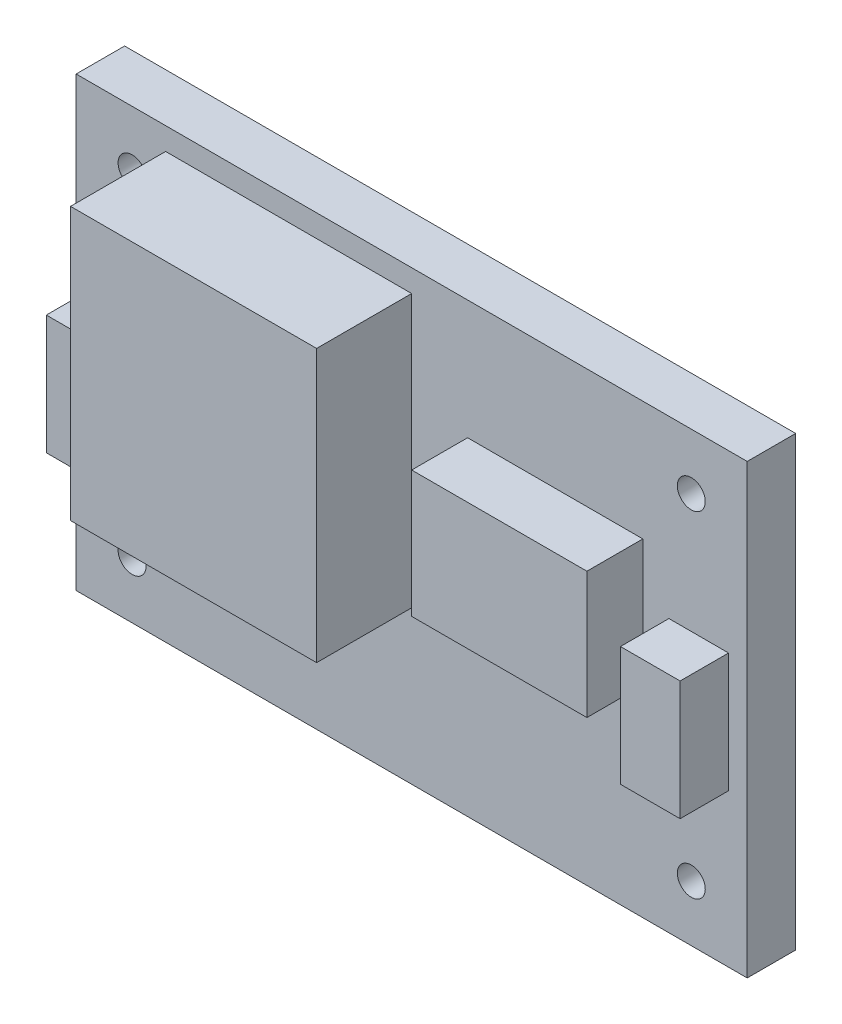
ISO-10303-21;
HEADER;
FILE_DESCRIPTION(('STEP AP214'),'2;1');
FILE_NAME('part.step','',(''),(''),'','','');
FILE_SCHEMA(('AUTOMOTIVE_DESIGN { 1 0 10303 214 1 1 1 1 }'));
ENDSEC;
DATA;
#1=APPLICATION_CONTEXT('core data for automotive mechanical design processes');
#2=APPLICATION_PROTOCOL_DEFINITION('international standard','automotive_design',2000,#1);
#3=PRODUCT_CONTEXT('',#1,'mechanical');
#4=PRODUCT('Part','Part','',(#3));
#5=PRODUCT_RELATED_PRODUCT_CATEGORY('part','',(#4));
#6=PRODUCT_DEFINITION_FORMATION('','',#4);
#7=PRODUCT_DEFINITION_CONTEXT('part definition',#1,'design');
#8=PRODUCT_DEFINITION('design','',#6,#7);
#9=PRODUCT_DEFINITION_SHAPE('','',#8);
#10=(LENGTH_UNIT() NAMED_UNIT(*) SI_UNIT(.MILLI.,.METRE.));
#11=(NAMED_UNIT(*) PLANE_ANGLE_UNIT() SI_UNIT($,.RADIAN.));
#12=(NAMED_UNIT(*) SI_UNIT($,.STERADIAN.) SOLID_ANGLE_UNIT());
#13=UNCERTAINTY_MEASURE_WITH_UNIT(LENGTH_MEASURE(1.E-05),#10,'distance_accuracy_value','');
#14=(GEOMETRIC_REPRESENTATION_CONTEXT(3) GLOBAL_UNCERTAINTY_ASSIGNED_CONTEXT((#13)) GLOBAL_UNIT_ASSIGNED_CONTEXT((#10,
#11,#12)) REPRESENTATION_CONTEXT('',''));
#15=CARTESIAN_POINT('',(0.,0.,0.));
#16=DIRECTION('',(0.,0.,1.));
#17=DIRECTION('',(1.,0.,0.));
#18=AXIS2_PLACEMENT_3D('',#15,#16,#17);
#19=CARTESIAN_POINT('',(0.,0.,1.3));
#20=DIRECTION('',(0.,0.,-1.));
#21=DIRECTION('',(-1.,0.,0.));
#22=AXIS2_PLACEMENT_3D('',#19,#20,#21);
#23=PLANE('',#22);
#24=DIRECTION('',(0.,-1.,0.));
#25=VECTOR('',#24,1.);
#26=CARTESIAN_POINT('',(0.5,7.3,1.3));
#27=LINE('',#26,#25);
#28=CARTESIAN_POINT('',(0.5,7.3,1.3));
#29=VERTEX_POINT('',#28);
#30=CARTESIAN_POINT('',(0.5,4.1,1.3));
#31=VERTEX_POINT('',#30);
#32=EDGE_CURVE('E191',#29,#31,#27,.T.);
#33=ORIENTED_EDGE('',*,*,#32,.F.);
#34=DIRECTION('',(-1.,0.,0.));
#35=VECTOR('',#34,1.);
#36=CARTESIAN_POINT('',(0.5,7.3,1.3));
#37=LINE('',#36,#35);
#38=CARTESIAN_POINT('',(2.1,7.3,1.3));
#39=VERTEX_POINT('',#38);
#40=EDGE_CURVE('E204',#39,#29,#37,.T.);
#41=ORIENTED_EDGE('',*,*,#40,.F.);
#42=DIRECTION('',(0.,1.,0.));
#43=VECTOR('',#42,1.);
#44=CARTESIAN_POINT('',(2.1,7.3,1.3));
#45=LINE('',#44,#43);
#46=CARTESIAN_POINT('',(2.1,4.1,1.3));
#47=VERTEX_POINT('',#46);
#48=EDGE_CURVE('E213',#47,#39,#45,.T.);
#49=ORIENTED_EDGE('',*,*,#48,.F.);
#50=DIRECTION('',(1.,0.,0.));
#51=VECTOR('',#50,1.);
#52=CARTESIAN_POINT('',(0.5,4.1,1.3));
#53=LINE('',#52,#51);
#54=EDGE_CURVE('E194',#31,#47,#53,.T.);
#55=ORIENTED_EDGE('',*,*,#54,.F.);
#56=EDGE_LOOP('',(#33,#41,#49,#55));
#57=FACE_BOUND('',#56,.T.);
#58=CARTESIAN_POINT('',(1.5,1.5,1.3));
#59=DIRECTION('',(0.,0.,1.));
#60=DIRECTION('',(-1.,0.,0.));
#61=AXIS2_PLACEMENT_3D('',#58,#59,#60);
#62=CIRCLE('',#61,0.375);
#63=CARTESIAN_POINT('',(1.125,1.5,1.3));
#64=VERTEX_POINT('',#63);
#65=EDGE_CURVE('E229',#64,#64,#62,.T.);
#66=ORIENTED_EDGE('',*,*,#65,.F.);
#67=EDGE_LOOP('',(#66));
#68=FACE_BOUND('',#67,.T.);
#69=CARTESIAN_POINT('',(16.5,1.5,1.3));
#70=DIRECTION('',(0.,0.,1.));
#71=DIRECTION('',(1.,0.,0.));
#72=AXIS2_PLACEMENT_3D('',#69,#70,#71);
#73=CIRCLE('',#72,0.374999999999996);
#74=CARTESIAN_POINT('',(16.875,1.5,1.3));
#75=VERTEX_POINT('',#74);
#76=EDGE_CURVE('E240',#75,#75,#73,.T.);
#77=ORIENTED_EDGE('',*,*,#76,.F.);
#78=EDGE_LOOP('',(#77));
#79=FACE_BOUND('',#78,.T.);
#80=CARTESIAN_POINT('',(16.5,10.5,1.3));
#81=DIRECTION('',(0.,0.,1.));
#82=DIRECTION('',(-1.,0.,0.));
#83=AXIS2_PLACEMENT_3D('',#80,#81,#82);
#84=CIRCLE('',#83,0.374999999999996);
#85=CARTESIAN_POINT('',(16.125,10.5,1.3));
#86=VERTEX_POINT('',#85);
#87=EDGE_CURVE('E234',#86,#86,#84,.T.);
#88=ORIENTED_EDGE('',*,*,#87,.F.);
#89=EDGE_LOOP('',(#88));
#90=FACE_BOUND('',#89,.T.);
#91=CARTESIAN_POINT('',(1.5,10.5,1.3));
#92=DIRECTION('',(0.,0.,1.));
#93=DIRECTION('',(1.,0.,0.));
#94=AXIS2_PLACEMENT_3D('',#91,#92,#93);
#95=CIRCLE('',#94,0.375);
#96=CARTESIAN_POINT('',(1.875,10.5,1.3));
#97=VERTEX_POINT('',#96);
#98=EDGE_CURVE('E233',#97,#97,#95,.T.);
#99=ORIENTED_EDGE('',*,*,#98,.F.);
#100=EDGE_LOOP('',(#99));
#101=FACE_BOUND('',#100,.T.);
#102=DIRECTION('',(0.,-1.,0.));
#103=VECTOR('',#102,1.);
#104=CARTESIAN_POINT('',(2.4,11.4,1.3));
#105=LINE('',#104,#103);
#106=CARTESIAN_POINT('',(2.4,11.4,1.3));
#107=VERTEX_POINT('',#106);
#108=CARTESIAN_POINT('',(2.4,4.1,1.3));
#109=VERTEX_POINT('',#108);
#110=EDGE_CURVE('E286',#107,#109,#105,.T.);
#111=ORIENTED_EDGE('',*,*,#110,.F.);
#112=DIRECTION('',(-1.,0.,0.));
#113=VECTOR('',#112,1.);
#114=CARTESIAN_POINT('',(2.4,11.4,1.3));
#115=LINE('',#114,#113);
#116=CARTESIAN_POINT('',(9.,11.4,1.3));
#117=VERTEX_POINT('',#116);
#118=EDGE_CURVE('E291',#117,#107,#115,.T.);
#119=ORIENTED_EDGE('',*,*,#118,.F.);
#120=DIRECTION('',(0.,1.,0.));
#121=VECTOR('',#120,1.);
#122=CARTESIAN_POINT('',(9.,11.4,1.3));
#123=LINE('',#122,#121);
#124=CARTESIAN_POINT('',(9.,4.1,1.3));
#125=VERTEX_POINT('',#124);
#126=EDGE_CURVE('E303',#125,#117,#123,.T.);
#127=ORIENTED_EDGE('',*,*,#126,.F.);
#128=DIRECTION('',(1.,0.,0.));
#129=VECTOR('',#128,1.);
#130=CARTESIAN_POINT('',(2.4,4.1,1.3));
#131=LINE('',#130,#129);
#132=EDGE_CURVE('E300',#109,#125,#131,.T.);
#133=ORIENTED_EDGE('',*,*,#132,.F.);
#134=EDGE_LOOP('',(#111,#119,#127,#133));
#135=FACE_BOUND('',#134,.T.);
#136=DIRECTION('',(0.,-1.,0.));
#137=VECTOR('',#136,1.);
#138=CARTESIAN_POINT('',(0.,0.,1.3));
#139=LINE('',#138,#137);
#140=CARTESIAN_POINT('',(0.,12.,1.3));
#141=VERTEX_POINT('',#140);
#142=CARTESIAN_POINT('',(0.,0.,1.3));
#143=VERTEX_POINT('',#142);
#144=EDGE_CURVE('E320',#141,#143,#139,.T.);
#145=ORIENTED_EDGE('',*,*,#144,.T.);
#146=DIRECTION('',(1.,0.,0.));
#147=VECTOR('',#146,1.);
#148=CARTESIAN_POINT('',(0.,0.,1.3));
#149=LINE('',#148,#147);
#150=CARTESIAN_POINT('',(18.,0.,1.3));
#151=VERTEX_POINT('',#150);
#152=EDGE_CURVE('E323',#143,#151,#149,.T.);
#153=ORIENTED_EDGE('',*,*,#152,.T.);
#154=DIRECTION('',(0.,1.,0.));
#155=VECTOR('',#154,1.);
#156=CARTESIAN_POINT('',(18.,0.,1.3));
#157=LINE('',#156,#155);
#158=CARTESIAN_POINT('',(18.,12.,1.3));
#159=VERTEX_POINT('',#158);
#160=EDGE_CURVE('E326',#151,#159,#157,.T.);
#161=ORIENTED_EDGE('',*,*,#160,.T.);
#162=DIRECTION('',(-1.,0.,0.));
#163=VECTOR('',#162,1.);
#164=CARTESIAN_POINT('',(0.,12.,1.3));
#165=LINE('',#164,#163);
#166=EDGE_CURVE('E328',#159,#141,#165,.T.);
#167=ORIENTED_EDGE('',*,*,#166,.T.);
#168=EDGE_LOOP('',(#145,#153,#161,#167));
#169=FACE_BOUND('',#168,.T.);
#170=DIRECTION('',(0.,-1.,0.));
#171=VECTOR('',#170,1.);
#172=CARTESIAN_POINT('',(10.5,8.8,1.3));
#173=LINE('',#172,#171);
#174=CARTESIAN_POINT('',(10.5,8.8,1.3));
#175=VERTEX_POINT('',#174);
#176=CARTESIAN_POINT('',(10.5,5.4,1.3));
#177=VERTEX_POINT('',#176);
#178=EDGE_CURVE('E251',#175,#177,#173,.T.);
#179=ORIENTED_EDGE('',*,*,#178,.F.);
#180=DIRECTION('',(-1.,0.,0.));
#181=VECTOR('',#180,1.);
#182=CARTESIAN_POINT('',(10.5,8.8,1.3));
#183=LINE('',#182,#181);
#184=CARTESIAN_POINT('',(15.2,8.8,1.3));
#185=VERTEX_POINT('',#184);
#186=EDGE_CURVE('E258',#185,#175,#183,.T.);
#187=ORIENTED_EDGE('',*,*,#186,.F.);
#188=DIRECTION('',(0.,1.,0.));
#189=VECTOR('',#188,1.);
#190=CARTESIAN_POINT('',(15.2,8.8,1.3));
#191=LINE('',#190,#189);
#192=CARTESIAN_POINT('',(15.2,5.4,1.3));
#193=VERTEX_POINT('',#192);
#194=EDGE_CURVE('E270',#193,#185,#191,.T.);
#195=ORIENTED_EDGE('',*,*,#194,.F.);
#196=DIRECTION('',(1.,0.,0.));
#197=VECTOR('',#196,1.);
#198=CARTESIAN_POINT('',(10.5,5.4,1.3));
#199=LINE('',#198,#197);
#200=EDGE_CURVE('E267',#177,#193,#199,.T.);
#201=ORIENTED_EDGE('',*,*,#200,.F.);
#202=EDGE_LOOP('',(#179,#187,#195,#201));
#203=FACE_BOUND('',#202,.T.);
#204=DIRECTION('',(0.,-1.,0.));
#205=VECTOR('',#204,1.);
#206=CARTESIAN_POINT('',(15.9,7.3,1.3));
#207=LINE('',#206,#205);
#208=CARTESIAN_POINT('',(15.9,7.3,1.3));
#209=VERTEX_POINT('',#208);
#210=CARTESIAN_POINT('',(15.9,4.1,1.3));
#211=VERTEX_POINT('',#210);
#212=EDGE_CURVE('E190',#209,#211,#207,.T.);
#213=ORIENTED_EDGE('',*,*,#212,.F.);
#214=DIRECTION('',(-1.,0.,0.));
#215=VECTOR('',#214,1.);
#216=CARTESIAN_POINT('',(15.9,7.3,1.3));
#217=LINE('',#216,#215);
#218=CARTESIAN_POINT('',(17.5,7.3,1.3));
#219=VERTEX_POINT('',#218);
#220=EDGE_CURVE('E187',#219,#209,#217,.T.);
#221=ORIENTED_EDGE('',*,*,#220,.F.);
#222=DIRECTION('',(0.,1.,0.));
#223=VECTOR('',#222,1.);
#224=CARTESIAN_POINT('',(17.5,7.3,1.3));
#225=LINE('',#224,#223);
#226=CARTESIAN_POINT('',(17.5,4.1,1.3));
#227=VERTEX_POINT('',#226);
#228=EDGE_CURVE('E53',#227,#219,#225,.T.);
#229=ORIENTED_EDGE('',*,*,#228,.F.);
#230=DIRECTION('',(1.,0.,0.));
#231=VECTOR('',#230,1.);
#232=CARTESIAN_POINT('',(15.9,4.1,1.3));
#233=LINE('',#232,#231);
#234=EDGE_CURVE('E48',#211,#227,#233,.T.);
#235=ORIENTED_EDGE('',*,*,#234,.F.);
#236=EDGE_LOOP('',(#213,#221,#229,#235));
#237=FACE_BOUND('',#236,.T.);
#238=ADVANCED_FACE('F33',(#57,#68,#79,#90,#101,#135,#169,#203,#237),#23,.F.);
#239=CARTESIAN_POINT('',(0.,0.,1.3));
#240=DIRECTION('',(1.,0.,0.));
#241=DIRECTION('',(0.,0.,-1.));
#242=AXIS2_PLACEMENT_3D('',#239,#240,#241);
#243=PLANE('',#242);
#244=DIRECTION('',(0.,-1.,0.));
#245=VECTOR('',#244,1.);
#246=CARTESIAN_POINT('',(0.,0.,0.));
#247=LINE('',#246,#245);
#248=CARTESIAN_POINT('',(0.,12.,0.));
#249=VERTEX_POINT('',#248);
#250=CARTESIAN_POINT('',(0.,0.,0.));
#251=VERTEX_POINT('',#250);
#252=EDGE_CURVE('E319',#249,#251,#247,.T.);
#253=ORIENTED_EDGE('',*,*,#252,.T.);
#254=DIRECTION('',(0.,0.,-1.));
#255=VECTOR('',#254,1.);
#256=CARTESIAN_POINT('',(0.,0.,1.3));
#257=LINE('',#256,#255);
#258=EDGE_CURVE('E11',#143,#251,#257,.T.);
#259=ORIENTED_EDGE('',*,*,#258,.F.);
#260=ORIENTED_EDGE('',*,*,#144,.F.);
#261=DIRECTION('',(0.,0.,-1.));
#262=VECTOR('',#261,1.);
#263=CARTESIAN_POINT('',(0.,12.,1.3));
#264=LINE('',#263,#262);
#265=EDGE_CURVE('E330',#141,#249,#264,.T.);
#266=ORIENTED_EDGE('',*,*,#265,.T.);
#267=EDGE_LOOP('',(#253,#259,#260,#266));
#268=FACE_BOUND('',#267,.T.);
#269=ADVANCED_FACE('F35',(#268),#243,.F.);
#270=CARTESIAN_POINT('',(0.,0.,1.3));
#271=DIRECTION('',(0.,1.,0.));
#272=DIRECTION('',(0.,0.,1.));
#273=AXIS2_PLACEMENT_3D('',#270,#271,#272);
#274=PLANE('',#273);
#275=DIRECTION('',(1.,0.,0.));
#276=VECTOR('',#275,1.);
#277=CARTESIAN_POINT('',(0.,0.,0.));
#278=LINE('',#277,#276);
#279=CARTESIAN_POINT('',(18.,0.,0.));
#280=VERTEX_POINT('',#279);
#281=EDGE_CURVE('E333',#251,#280,#278,.T.);
#282=ORIENTED_EDGE('',*,*,#281,.T.);
#283=DIRECTION('',(0.,0.,-1.));
#284=VECTOR('',#283,1.);
#285=CARTESIAN_POINT('',(18.,0.,1.3));
#286=LINE('',#285,#284);
#287=EDGE_CURVE('E41',#151,#280,#286,.T.);
#288=ORIENTED_EDGE('',*,*,#287,.F.);
#289=ORIENTED_EDGE('',*,*,#152,.F.);
#290=ORIENTED_EDGE('',*,*,#258,.T.);
#291=EDGE_LOOP('',(#282,#288,#289,#290));
#292=FACE_BOUND('',#291,.T.);
#293=ADVANCED_FACE('F363',(#292),#274,.F.);
#294=CARTESIAN_POINT('',(18.,0.,1.3));
#295=DIRECTION('',(-1.,0.,0.));
#296=DIRECTION('',(0.,0.,1.));
#297=AXIS2_PLACEMENT_3D('',#294,#295,#296);
#298=PLANE('',#297);
#299=DIRECTION('',(0.,1.,0.));
#300=VECTOR('',#299,1.);
#301=CARTESIAN_POINT('',(18.,0.,0.));
#302=LINE('',#301,#300);
#303=CARTESIAN_POINT('',(18.,12.,0.));
#304=VERTEX_POINT('',#303);
#305=EDGE_CURVE('E335',#280,#304,#302,.T.);
#306=ORIENTED_EDGE('',*,*,#305,.T.);
#307=DIRECTION('',(0.,0.,-1.));
#308=VECTOR('',#307,1.);
#309=CARTESIAN_POINT('',(18.,12.,1.3));
#310=LINE('',#309,#308);
#311=EDGE_CURVE('E340',#159,#304,#310,.T.);
#312=ORIENTED_EDGE('',*,*,#311,.F.);
#313=ORIENTED_EDGE('',*,*,#160,.F.);
#314=ORIENTED_EDGE('',*,*,#287,.T.);
#315=EDGE_LOOP('',(#306,#312,#313,#314));
#316=FACE_BOUND('',#315,.T.);
#317=ADVANCED_FACE('F347',(#316),#298,.F.);
#318=CARTESIAN_POINT('',(0.,12.,1.3));
#319=DIRECTION('',(0.,-1.,0.));
#320=DIRECTION('',(0.,0.,-1.));
#321=AXIS2_PLACEMENT_3D('',#318,#319,#320);
#322=PLANE('',#321);
#323=DIRECTION('',(-1.,0.,0.));
#324=VECTOR('',#323,1.);
#325=CARTESIAN_POINT('',(0.,12.,0.));
#326=LINE('',#325,#324);
#327=EDGE_CURVE('E324',#304,#249,#326,.T.);
#328=ORIENTED_EDGE('',*,*,#327,.T.);
#329=ORIENTED_EDGE('',*,*,#265,.F.);
#330=ORIENTED_EDGE('',*,*,#166,.F.);
#331=ORIENTED_EDGE('',*,*,#311,.T.);
#332=EDGE_LOOP('',(#328,#329,#330,#331));
#333=FACE_BOUND('',#332,.T.);
#334=ADVANCED_FACE('F356',(#333),#322,.F.);
#335=CARTESIAN_POINT('',(0.,0.,0.));
#336=DIRECTION('',(0.,0.,-1.));
#337=DIRECTION('',(-1.,0.,0.));
#338=AXIS2_PLACEMENT_3D('',#335,#336,#337);
#339=PLANE('',#338);
#340=CARTESIAN_POINT('',(1.5,1.5,0.));
#341=DIRECTION('',(0.,0.,1.));
#342=DIRECTION('',(-1.,0.,0.));
#343=AXIS2_PLACEMENT_3D('',#340,#341,#342);
#344=CIRCLE('',#343,0.375);
#345=CARTESIAN_POINT('',(1.125,1.5,0.));
#346=VERTEX_POINT('',#345);
#347=EDGE_CURVE('E243',#346,#346,#344,.T.);
#348=ORIENTED_EDGE('',*,*,#347,.T.);
#349=EDGE_LOOP('',(#348));
#350=FACE_BOUND('',#349,.T.);
#351=CARTESIAN_POINT('',(16.5,1.5,0.));
#352=DIRECTION('',(0.,0.,1.));
#353=DIRECTION('',(1.,0.,0.));
#354=AXIS2_PLACEMENT_3D('',#351,#352,#353);
#355=CIRCLE('',#354,0.374999999999996);
#356=CARTESIAN_POINT('',(16.875,1.5,0.));
#357=VERTEX_POINT('',#356);
#358=EDGE_CURVE('E237',#357,#357,#355,.T.);
#359=ORIENTED_EDGE('',*,*,#358,.T.);
#360=EDGE_LOOP('',(#359));
#361=FACE_BOUND('',#360,.T.);
#362=CARTESIAN_POINT('',(16.5,10.5,0.));
#363=DIRECTION('',(0.,0.,1.));
#364=DIRECTION('',(-1.,0.,0.));
#365=AXIS2_PLACEMENT_3D('',#362,#363,#364);
#366=CIRCLE('',#365,0.374999999999996);
#367=CARTESIAN_POINT('',(16.125,10.5,0.));
#368=VERTEX_POINT('',#367);
#369=EDGE_CURVE('E230',#368,#368,#366,.T.);
#370=ORIENTED_EDGE('',*,*,#369,.T.);
#371=EDGE_LOOP('',(#370));
#372=FACE_BOUND('',#371,.T.);
#373=CARTESIAN_POINT('',(1.5,10.5,0.));
#374=DIRECTION('',(0.,0.,1.));
#375=DIRECTION('',(1.,0.,0.));
#376=AXIS2_PLACEMENT_3D('',#373,#374,#375);
#377=CIRCLE('',#376,0.375);
#378=CARTESIAN_POINT('',(1.875,10.5,0.));
#379=VERTEX_POINT('',#378);
#380=EDGE_CURVE('E248',#379,#379,#377,.T.);
#381=ORIENTED_EDGE('',*,*,#380,.T.);
#382=EDGE_LOOP('',(#381));
#383=FACE_BOUND('',#382,.T.);
#384=ORIENTED_EDGE('',*,*,#252,.F.);
#385=ORIENTED_EDGE('',*,*,#327,.F.);
#386=ORIENTED_EDGE('',*,*,#305,.F.);
#387=ORIENTED_EDGE('',*,*,#281,.F.);
#388=EDGE_LOOP('',(#384,#385,#386,#387));
#389=FACE_BOUND('',#388,.T.);
#390=ADVANCED_FACE('F353',(#350,#361,#372,#383,#389),#339,.T.);
#391=CARTESIAN_POINT('',(2.4,11.4,3.85));
#392=DIRECTION('',(1.,0.,0.));
#393=DIRECTION('',(0.,1.,0.));
#394=AXIS2_PLACEMENT_3D('',#391,#392,#393);
#395=PLANE('',#394);
#396=ORIENTED_EDGE('',*,*,#110,.T.);
#397=DIRECTION('',(0.,0.,-1.));
#398=VECTOR('',#397,1.);
#399=CARTESIAN_POINT('',(2.4,4.1,3.85));
#400=LINE('',#399,#398);
#401=CARTESIAN_POINT('',(2.4,4.1,3.85));
#402=VERTEX_POINT('',#401);
#403=EDGE_CURVE('E316',#402,#109,#400,.T.);
#404=ORIENTED_EDGE('',*,*,#403,.F.);
#405=DIRECTION('',(0.,-1.,0.));
#406=VECTOR('',#405,1.);
#407=CARTESIAN_POINT('',(2.4,11.4,3.85));
#408=LINE('',#407,#406);
#409=CARTESIAN_POINT('',(2.4,11.4,3.85));
#410=VERTEX_POINT('',#409);
#411=EDGE_CURVE('E287',#410,#402,#408,.T.);
#412=ORIENTED_EDGE('',*,*,#411,.F.);
#413=DIRECTION('',(0.,0.,-1.));
#414=VECTOR('',#413,1.);
#415=CARTESIAN_POINT('',(2.4,11.4,3.85));
#416=LINE('',#415,#414);
#417=EDGE_CURVE('E297',#410,#107,#416,.T.);
#418=ORIENTED_EDGE('',*,*,#417,.T.);
#419=EDGE_LOOP('',(#396,#404,#412,#418));
#420=FACE_BOUND('',#419,.T.);
#421=ADVANCED_FACE('F378',(#420),#395,.F.);
#422=CARTESIAN_POINT('',(2.4,4.1,3.85));
#423=DIRECTION('',(0.,1.,0.));
#424=DIRECTION('',(0.,0.,1.));
#425=AXIS2_PLACEMENT_3D('',#422,#423,#424);
#426=PLANE('',#425);
#427=ORIENTED_EDGE('',*,*,#132,.T.);
#428=DIRECTION('',(0.,0.,-1.));
#429=VECTOR('',#428,1.);
#430=CARTESIAN_POINT('',(9.,4.1,3.85));
#431=LINE('',#430,#429);
#432=CARTESIAN_POINT('',(9.,4.1,3.85));
#433=VERTEX_POINT('',#432);
#434=EDGE_CURVE('E313',#433,#125,#431,.T.);
#435=ORIENTED_EDGE('',*,*,#434,.F.);
#436=DIRECTION('',(1.,0.,0.));
#437=VECTOR('',#436,1.);
#438=CARTESIAN_POINT('',(2.4,4.1,3.85));
#439=LINE('',#438,#437);
#440=EDGE_CURVE('E290',#402,#433,#439,.T.);
#441=ORIENTED_EDGE('',*,*,#440,.F.);
#442=ORIENTED_EDGE('',*,*,#403,.T.);
#443=EDGE_LOOP('',(#427,#435,#441,#442));
#444=FACE_BOUND('',#443,.T.);
#445=ADVANCED_FACE('F400',(#444),#426,.F.);
#446=CARTESIAN_POINT('',(9.,11.4,3.85));
#447=DIRECTION('',(-1.,0.,0.));
#448=DIRECTION('',(0.,-1.,0.));
#449=AXIS2_PLACEMENT_3D('',#446,#447,#448);
#450=PLANE('',#449);
#451=ORIENTED_EDGE('',*,*,#126,.T.);
#452=DIRECTION('',(0.,0.,-1.));
#453=VECTOR('',#452,1.);
#454=CARTESIAN_POINT('',(9.,11.4,3.85));
#455=LINE('',#454,#453);
#456=CARTESIAN_POINT('',(9.,11.4,3.85));
#457=VERTEX_POINT('',#456);
#458=EDGE_CURVE('E310',#457,#117,#455,.T.);
#459=ORIENTED_EDGE('',*,*,#458,.F.);
#460=DIRECTION('',(0.,1.,0.));
#461=VECTOR('',#460,1.);
#462=CARTESIAN_POINT('',(9.,11.4,3.85));
#463=LINE('',#462,#461);
#464=EDGE_CURVE('E293',#433,#457,#463,.T.);
#465=ORIENTED_EDGE('',*,*,#464,.F.);
#466=ORIENTED_EDGE('',*,*,#434,.T.);
#467=EDGE_LOOP('',(#451,#459,#465,#466));
#468=FACE_BOUND('',#467,.T.);
#469=ADVANCED_FACE('F407',(#468),#450,.F.);
#470=CARTESIAN_POINT('',(2.4,11.4,3.85));
#471=DIRECTION('',(0.,-1.,0.));
#472=DIRECTION('',(1.,0.,0.));
#473=AXIS2_PLACEMENT_3D('',#470,#471,#472);
#474=PLANE('',#473);
#475=ORIENTED_EDGE('',*,*,#118,.T.);
#476=ORIENTED_EDGE('',*,*,#417,.F.);
#477=DIRECTION('',(-1.,0.,0.));
#478=VECTOR('',#477,1.);
#479=CARTESIAN_POINT('',(2.4,11.4,3.85));
#480=LINE('',#479,#478);
#481=EDGE_CURVE('E295',#457,#410,#480,.T.);
#482=ORIENTED_EDGE('',*,*,#481,.F.);
#483=ORIENTED_EDGE('',*,*,#458,.T.);
#484=EDGE_LOOP('',(#475,#476,#482,#483));
#485=FACE_BOUND('',#484,.T.);
#486=ADVANCED_FACE('F414',(#485),#474,.F.);
#487=CARTESIAN_POINT('',(0.,0.,3.85));
#488=DIRECTION('',(0.,0.,1.));
#489=DIRECTION('',(1.,0.,0.));
#490=AXIS2_PLACEMENT_3D('',#487,#488,#489);
#491=PLANE('',#490);
#492=ORIENTED_EDGE('',*,*,#411,.T.);
#493=ORIENTED_EDGE('',*,*,#440,.T.);
#494=ORIENTED_EDGE('',*,*,#464,.T.);
#495=ORIENTED_EDGE('',*,*,#481,.T.);
#496=EDGE_LOOP('',(#492,#493,#494,#495));
#497=FACE_BOUND('',#496,.T.);
#498=ADVANCED_FACE('F422',(#497),#491,.T.);
#499=CARTESIAN_POINT('',(10.5,8.8,2.8));
#500=DIRECTION('',(1.,0.,0.));
#501=DIRECTION('',(0.,0.,-1.));
#502=AXIS2_PLACEMENT_3D('',#499,#500,#501);
#503=PLANE('',#502);
#504=ORIENTED_EDGE('',*,*,#178,.T.);
#505=DIRECTION('',(0.,0.,-1.));
#506=VECTOR('',#505,1.);
#507=CARTESIAN_POINT('',(10.5,5.4,2.8));
#508=LINE('',#507,#506);
#509=CARTESIAN_POINT('',(10.5,5.4,2.8));
#510=VERTEX_POINT('',#509);
#511=EDGE_CURVE('E283',#510,#177,#508,.T.);
#512=ORIENTED_EDGE('',*,*,#511,.F.);
#513=DIRECTION('',(0.,-1.,0.));
#514=VECTOR('',#513,1.);
#515=CARTESIAN_POINT('',(10.5,8.8,2.8));
#516=LINE('',#515,#514);
#517=CARTESIAN_POINT('',(10.5,8.8,2.8));
#518=VERTEX_POINT('',#517);
#519=EDGE_CURVE('E254',#518,#510,#516,.T.);
#520=ORIENTED_EDGE('',*,*,#519,.F.);
#521=DIRECTION('',(0.,0.,-1.));
#522=VECTOR('',#521,1.);
#523=CARTESIAN_POINT('',(10.5,8.8,2.8));
#524=LINE('',#523,#522);
#525=EDGE_CURVE('E264',#518,#175,#524,.T.);
#526=ORIENTED_EDGE('',*,*,#525,.T.);
#527=EDGE_LOOP('',(#504,#512,#520,#526));
#528=FACE_BOUND('',#527,.T.);
#529=ADVANCED_FACE('F430',(#528),#503,.F.);
#530=CARTESIAN_POINT('',(10.5,5.4,2.8));
#531=DIRECTION('',(0.,1.,0.));
#532=DIRECTION('',(0.,0.,1.));
#533=AXIS2_PLACEMENT_3D('',#530,#531,#532);
#534=PLANE('',#533);
#535=ORIENTED_EDGE('',*,*,#200,.T.);
#536=DIRECTION('',(0.,0.,-1.));
#537=VECTOR('',#536,1.);
#538=CARTESIAN_POINT('',(15.2,5.4,2.8));
#539=LINE('',#538,#537);
#540=CARTESIAN_POINT('',(15.2,5.4,2.8));
#541=VERTEX_POINT('',#540);
#542=EDGE_CURVE('E280',#541,#193,#539,.T.);
#543=ORIENTED_EDGE('',*,*,#542,.F.);
#544=DIRECTION('',(1.,0.,0.));
#545=VECTOR('',#544,1.);
#546=CARTESIAN_POINT('',(10.5,5.4,2.8));
#547=LINE('',#546,#545);
#548=EDGE_CURVE('E257',#510,#541,#547,.T.);
#549=ORIENTED_EDGE('',*,*,#548,.F.);
#550=ORIENTED_EDGE('',*,*,#511,.T.);
#551=EDGE_LOOP('',(#535,#543,#549,#550));
#552=FACE_BOUND('',#551,.T.);
#553=ADVANCED_FACE('F438',(#552),#534,.F.);
#554=CARTESIAN_POINT('',(15.2,8.8,2.8));
#555=DIRECTION('',(-1.,0.,0.));
#556=DIRECTION('',(0.,0.,1.));
#557=AXIS2_PLACEMENT_3D('',#554,#555,#556);
#558=PLANE('',#557);
#559=ORIENTED_EDGE('',*,*,#194,.T.);
#560=DIRECTION('',(0.,0.,-1.));
#561=VECTOR('',#560,1.);
#562=CARTESIAN_POINT('',(15.2,8.8,2.8));
#563=LINE('',#562,#561);
#564=CARTESIAN_POINT('',(15.2,8.8,2.8));
#565=VERTEX_POINT('',#564);
#566=EDGE_CURVE('E277',#565,#185,#563,.T.);
#567=ORIENTED_EDGE('',*,*,#566,.F.);
#568=DIRECTION('',(0.,1.,0.));
#569=VECTOR('',#568,1.);
#570=CARTESIAN_POINT('',(15.2,8.8,2.8));
#571=LINE('',#570,#569);
#572=EDGE_CURVE('E260',#541,#565,#571,.T.);
#573=ORIENTED_EDGE('',*,*,#572,.F.);
#574=ORIENTED_EDGE('',*,*,#542,.T.);
#575=EDGE_LOOP('',(#559,#567,#573,#574));
#576=FACE_BOUND('',#575,.T.);
#577=ADVANCED_FACE('F446',(#576),#558,.F.);
#578=CARTESIAN_POINT('',(10.5,8.8,2.8));
#579=DIRECTION('',(0.,-1.,0.));
#580=DIRECTION('',(0.,0.,-1.));
#581=AXIS2_PLACEMENT_3D('',#578,#579,#580);
#582=PLANE('',#581);
#583=ORIENTED_EDGE('',*,*,#186,.T.);
#584=ORIENTED_EDGE('',*,*,#525,.F.);
#585=DIRECTION('',(-1.,0.,0.));
#586=VECTOR('',#585,1.);
#587=CARTESIAN_POINT('',(10.5,8.8,2.8));
#588=LINE('',#587,#586);
#589=EDGE_CURVE('E262',#565,#518,#588,.T.);
#590=ORIENTED_EDGE('',*,*,#589,.F.);
#591=ORIENTED_EDGE('',*,*,#566,.T.);
#592=EDGE_LOOP('',(#583,#584,#590,#591));
#593=FACE_BOUND('',#592,.T.);
#594=ADVANCED_FACE('F454',(#593),#582,.F.);
#595=CARTESIAN_POINT('',(0.,0.,2.8));
#596=DIRECTION('',(0.,0.,1.));
#597=DIRECTION('',(1.,0.,0.));
#598=AXIS2_PLACEMENT_3D('',#595,#596,#597);
#599=PLANE('',#598);
#600=ORIENTED_EDGE('',*,*,#519,.T.);
#601=ORIENTED_EDGE('',*,*,#548,.T.);
#602=ORIENTED_EDGE('',*,*,#572,.T.);
#603=ORIENTED_EDGE('',*,*,#589,.T.);
#604=EDGE_LOOP('',(#600,#601,#602,#603));
#605=FACE_BOUND('',#604,.T.);
#606=ADVANCED_FACE('F462',(#605),#599,.T.);
#607=CARTESIAN_POINT('',(1.5,10.5,0.));
#608=DIRECTION('',(0.,0.,1.));
#609=DIRECTION('',(1.,0.,0.));
#610=AXIS2_PLACEMENT_3D('',#607,#608,#609);
#611=CYLINDRICAL_SURFACE('',#610,0.375);
#612=ORIENTED_EDGE('',*,*,#380,.F.);
#613=EDGE_LOOP('',(#612));
#614=FACE_BOUND('',#613,.T.);
#615=ORIENTED_EDGE('',*,*,#98,.T.);
#616=EDGE_LOOP('',(#615));
#617=FACE_BOUND('',#616,.T.);
#618=ADVANCED_FACE('F469',(#614,#617),#611,.F.);
#619=CARTESIAN_POINT('',(16.5,10.5,0.));
#620=DIRECTION('',(0.,0.,1.));
#621=DIRECTION('',(1.,0.,0.));
#622=AXIS2_PLACEMENT_3D('',#619,#620,#621);
#623=CYLINDRICAL_SURFACE('',#622,0.374999999999996);
#624=ORIENTED_EDGE('',*,*,#369,.F.);
#625=EDGE_LOOP('',(#624));
#626=FACE_BOUND('',#625,.T.);
#627=ORIENTED_EDGE('',*,*,#87,.T.);
#628=EDGE_LOOP('',(#627));
#629=FACE_BOUND('',#628,.T.);
#630=ADVANCED_FACE('F476',(#626,#629),#623,.F.);
#631=CARTESIAN_POINT('',(16.5,1.5,0.));
#632=DIRECTION('',(0.,0.,1.));
#633=DIRECTION('',(1.,0.,0.));
#634=AXIS2_PLACEMENT_3D('',#631,#632,#633);
#635=CYLINDRICAL_SURFACE('',#634,0.374999999999996);
#636=ORIENTED_EDGE('',*,*,#358,.F.);
#637=EDGE_LOOP('',(#636));
#638=FACE_BOUND('',#637,.T.);
#639=ORIENTED_EDGE('',*,*,#76,.T.);
#640=EDGE_LOOP('',(#639));
#641=FACE_BOUND('',#640,.T.);
#642=ADVANCED_FACE('F484',(#638,#641),#635,.F.);
#643=CARTESIAN_POINT('',(1.5,1.5,0.));
#644=DIRECTION('',(0.,0.,1.));
#645=DIRECTION('',(1.,0.,0.));
#646=AXIS2_PLACEMENT_3D('',#643,#644,#645);
#647=CYLINDRICAL_SURFACE('',#646,0.375);
#648=ORIENTED_EDGE('',*,*,#347,.F.);
#649=EDGE_LOOP('',(#648));
#650=FACE_BOUND('',#649,.T.);
#651=ORIENTED_EDGE('',*,*,#65,.T.);
#652=EDGE_LOOP('',(#651));
#653=FACE_BOUND('',#652,.T.);
#654=ADVANCED_FACE('F492',(#650,#653),#647,.F.);
#655=CARTESIAN_POINT('',(0.5,7.3,2.6));
#656=DIRECTION('',(1.,0.,0.));
#657=DIRECTION('',(0.,1.,0.));
#658=AXIS2_PLACEMENT_3D('',#655,#656,#657);
#659=PLANE('',#658);
#660=ORIENTED_EDGE('',*,*,#32,.T.);
#661=DIRECTION('',(0.,0.,-1.));
#662=VECTOR('',#661,1.);
#663=CARTESIAN_POINT('',(0.5,4.1,2.6));
#664=LINE('',#663,#662);
#665=CARTESIAN_POINT('',(0.5,4.1,2.6));
#666=VERTEX_POINT('',#665);
#667=EDGE_CURVE('E226',#666,#31,#664,.T.);
#668=ORIENTED_EDGE('',*,*,#667,.F.);
#669=DIRECTION('',(0.,-1.,0.));
#670=VECTOR('',#669,1.);
#671=CARTESIAN_POINT('',(0.5,7.3,2.6));
#672=LINE('',#671,#670);
#673=CARTESIAN_POINT('',(0.5,7.3,2.6));
#674=VERTEX_POINT('',#673);
#675=EDGE_CURVE('E200',#674,#666,#672,.T.);
#676=ORIENTED_EDGE('',*,*,#675,.F.);
#677=DIRECTION('',(0.,0.,-1.));
#678=VECTOR('',#677,1.);
#679=CARTESIAN_POINT('',(0.5,7.3,2.6));
#680=LINE('',#679,#678);
#681=EDGE_CURVE('E209',#674,#29,#680,.T.);
#682=ORIENTED_EDGE('',*,*,#681,.T.);
#683=EDGE_LOOP('',(#660,#668,#676,#682));
#684=FACE_BOUND('',#683,.T.);
#685=ADVANCED_FACE('F500',(#684),#659,.F.);
#686=CARTESIAN_POINT('',(0.5,4.1,2.6));
#687=DIRECTION('',(0.,1.,0.));
#688=DIRECTION('',(0.,0.,1.));
#689=AXIS2_PLACEMENT_3D('',#686,#687,#688);
#690=PLANE('',#689);
#691=ORIENTED_EDGE('',*,*,#54,.T.);
#692=DIRECTION('',(0.,0.,-1.));
#693=VECTOR('',#692,1.);
#694=CARTESIAN_POINT('',(2.1,4.1,2.6));
#695=LINE('',#694,#693);
#696=CARTESIAN_POINT('',(2.1,4.1,2.6));
#697=VERTEX_POINT('',#696);
#698=EDGE_CURVE('E223',#697,#47,#695,.T.);
#699=ORIENTED_EDGE('',*,*,#698,.F.);
#700=DIRECTION('',(1.,0.,0.));
#701=VECTOR('',#700,1.);
#702=CARTESIAN_POINT('',(0.5,4.1,2.6));
#703=LINE('',#702,#701);
#704=EDGE_CURVE('E203',#666,#697,#703,.T.);
#705=ORIENTED_EDGE('',*,*,#704,.F.);
#706=ORIENTED_EDGE('',*,*,#667,.T.);
#707=EDGE_LOOP('',(#691,#699,#705,#706));
#708=FACE_BOUND('',#707,.T.);
#709=ADVANCED_FACE('F508',(#708),#690,.F.);
#710=CARTESIAN_POINT('',(2.1,7.3,2.6));
#711=DIRECTION('',(-1.,0.,0.));
#712=DIRECTION('',(0.,-1.,0.));
#713=AXIS2_PLACEMENT_3D('',#710,#711,#712);
#714=PLANE('',#713);
#715=ORIENTED_EDGE('',*,*,#48,.T.);
#716=DIRECTION('',(0.,0.,-1.));
#717=VECTOR('',#716,1.);
#718=CARTESIAN_POINT('',(2.1,7.3,2.6));
#719=LINE('',#718,#717);
#720=CARTESIAN_POINT('',(2.1,7.3,2.6));
#721=VERTEX_POINT('',#720);
#722=EDGE_CURVE('E220',#721,#39,#719,.T.);
#723=ORIENTED_EDGE('',*,*,#722,.F.);
#724=DIRECTION('',(0.,1.,0.));
#725=VECTOR('',#724,1.);
#726=CARTESIAN_POINT('',(2.1,7.3,2.6));
#727=LINE('',#726,#725);
#728=EDGE_CURVE('E206',#697,#721,#727,.T.);
#729=ORIENTED_EDGE('',*,*,#728,.F.);
#730=ORIENTED_EDGE('',*,*,#698,.T.);
#731=EDGE_LOOP('',(#715,#723,#729,#730));
#732=FACE_BOUND('',#731,.T.);
#733=ADVANCED_FACE('F516',(#732),#714,.F.);
#734=CARTESIAN_POINT('',(0.5,7.3,2.6));
#735=DIRECTION('',(0.,-1.,0.));
#736=DIRECTION('',(0.,0.,-1.));
#737=AXIS2_PLACEMENT_3D('',#734,#735,#736);
#738=PLANE('',#737);
#739=ORIENTED_EDGE('',*,*,#40,.T.);
#740=ORIENTED_EDGE('',*,*,#681,.F.);
#741=DIRECTION('',(-1.,0.,0.));
#742=VECTOR('',#741,1.);
#743=CARTESIAN_POINT('',(0.5,7.3,2.6));
#744=LINE('',#743,#742);
#745=EDGE_CURVE('E208',#721,#674,#744,.T.);
#746=ORIENTED_EDGE('',*,*,#745,.F.);
#747=ORIENTED_EDGE('',*,*,#722,.T.);
#748=EDGE_LOOP('',(#739,#740,#746,#747));
#749=FACE_BOUND('',#748,.T.);
#750=ADVANCED_FACE('F524',(#749),#738,.F.);
#751=CARTESIAN_POINT('',(0.,0.,2.6));
#752=DIRECTION('',(0.,0.,1.));
#753=DIRECTION('',(1.,0.,0.));
#754=AXIS2_PLACEMENT_3D('',#751,#752,#753);
#755=PLANE('',#754);
#756=ORIENTED_EDGE('',*,*,#675,.T.);
#757=ORIENTED_EDGE('',*,*,#704,.T.);
#758=ORIENTED_EDGE('',*,*,#728,.T.);
#759=ORIENTED_EDGE('',*,*,#745,.T.);
#760=EDGE_LOOP('',(#756,#757,#758,#759));
#761=FACE_BOUND('',#760,.T.);
#762=ADVANCED_FACE('F532',(#761),#755,.T.);
#763=CARTESIAN_POINT('',(15.9,7.3,2.6));
#764=DIRECTION('',(1.,0.,0.));
#765=DIRECTION('',(0.,0.,-1.));
#766=AXIS2_PLACEMENT_3D('',#763,#764,#765);
#767=PLANE('',#766);
#768=ORIENTED_EDGE('',*,*,#212,.T.);
#769=DIRECTION('',(0.,0.,-1.));
#770=VECTOR('',#769,1.);
#771=CARTESIAN_POINT('',(15.9,4.1,2.6));
#772=LINE('',#771,#770);
#773=CARTESIAN_POINT('',(15.9,4.1,2.6));
#774=VERTEX_POINT('',#773);
#775=EDGE_CURVE('E171',#774,#211,#772,.T.);
#776=ORIENTED_EDGE('',*,*,#775,.F.);
#777=DIRECTION('',(0.,-1.,0.));
#778=VECTOR('',#777,1.);
#779=CARTESIAN_POINT('',(15.9,7.3,2.6));
#780=LINE('',#779,#778);
#781=CARTESIAN_POINT('',(15.9,7.3,2.6));
#782=VERTEX_POINT('',#781);
#783=EDGE_CURVE('E178',#782,#774,#780,.T.);
#784=ORIENTED_EDGE('',*,*,#783,.F.);
#785=DIRECTION('',(0.,0.,-1.));
#786=VECTOR('',#785,1.);
#787=CARTESIAN_POINT('',(15.9,7.3,2.6));
#788=LINE('',#787,#786);
#789=EDGE_CURVE('E649',#782,#209,#788,.T.);
#790=ORIENTED_EDGE('',*,*,#789,.T.);
#791=EDGE_LOOP('',(#768,#776,#784,#790));
#792=FACE_BOUND('',#791,.T.);
#793=ADVANCED_FACE('F189',(#792),#767,.F.);
#794=CARTESIAN_POINT('',(15.9,4.1,2.6));
#795=DIRECTION('',(0.,1.,0.));
#796=DIRECTION('',(0.,0.,1.));
#797=AXIS2_PLACEMENT_3D('',#794,#795,#796);
#798=PLANE('',#797);
#799=ORIENTED_EDGE('',*,*,#234,.T.);
#800=DIRECTION('',(0.,0.,-1.));
#801=VECTOR('',#800,1.);
#802=CARTESIAN_POINT('',(17.5,4.1,2.6));
#803=LINE('',#802,#801);
#804=CARTESIAN_POINT('',(17.5,4.1,2.6));
#805=VERTEX_POINT('',#804);
#806=EDGE_CURVE('E174',#805,#227,#803,.T.);
#807=ORIENTED_EDGE('',*,*,#806,.F.);
#808=DIRECTION('',(1.,0.,0.));
#809=VECTOR('',#808,1.);
#810=CARTESIAN_POINT('',(15.9,4.1,2.6));
#811=LINE('',#810,#809);
#812=EDGE_CURVE('E167',#774,#805,#811,.T.);
#813=ORIENTED_EDGE('',*,*,#812,.F.);
#814=ORIENTED_EDGE('',*,*,#775,.T.);
#815=EDGE_LOOP('',(#799,#807,#813,#814));
#816=FACE_BOUND('',#815,.T.);
#817=ADVANCED_FACE('F169',(#816),#798,.F.);
#818=CARTESIAN_POINT('',(17.5,7.3,2.6));
#819=DIRECTION('',(-1.,0.,0.));
#820=DIRECTION('',(0.,0.,1.));
#821=AXIS2_PLACEMENT_3D('',#818,#819,#820);
#822=PLANE('',#821);
#823=ORIENTED_EDGE('',*,*,#228,.T.);
#824=DIRECTION('',(0.,0.,-1.));
#825=VECTOR('',#824,1.);
#826=CARTESIAN_POINT('',(17.5,7.3,2.6));
#827=LINE('',#826,#825);
#828=CARTESIAN_POINT('',(17.5,7.3,2.6));
#829=VERTEX_POINT('',#828);
#830=EDGE_CURVE('E196',#829,#219,#827,.T.);
#831=ORIENTED_EDGE('',*,*,#830,.F.);
#832=DIRECTION('',(0.,1.,0.));
#833=VECTOR('',#832,1.);
#834=CARTESIAN_POINT('',(17.5,7.3,2.6));
#835=LINE('',#834,#833);
#836=EDGE_CURVE('E177',#805,#829,#835,.T.);
#837=ORIENTED_EDGE('',*,*,#836,.F.);
#838=ORIENTED_EDGE('',*,*,#806,.T.);
#839=EDGE_LOOP('',(#823,#831,#837,#838));
#840=FACE_BOUND('',#839,.T.);
#841=ADVANCED_FACE('F553',(#840),#822,.F.);
#842=CARTESIAN_POINT('',(15.9,7.3,2.6));
#843=DIRECTION('',(0.,-1.,0.));
#844=DIRECTION('',(0.,0.,-1.));
#845=AXIS2_PLACEMENT_3D('',#842,#843,#844);
#846=PLANE('',#845);
#847=ORIENTED_EDGE('',*,*,#220,.T.);
#848=ORIENTED_EDGE('',*,*,#789,.F.);
#849=DIRECTION('',(-1.,0.,0.));
#850=VECTOR('',#849,1.);
#851=CARTESIAN_POINT('',(15.9,7.3,2.6));
#852=LINE('',#851,#850);
#853=EDGE_CURVE('E183',#829,#782,#852,.T.);
#854=ORIENTED_EDGE('',*,*,#853,.F.);
#855=ORIENTED_EDGE('',*,*,#830,.T.);
#856=EDGE_LOOP('',(#847,#848,#854,#855));
#857=FACE_BOUND('',#856,.T.);
#858=ADVANCED_FACE('F560',(#857),#846,.F.);
#859=CARTESIAN_POINT('',(0.,0.,2.6));
#860=DIRECTION('',(0.,0.,1.));
#861=DIRECTION('',(1.,0.,0.));
#862=AXIS2_PLACEMENT_3D('',#859,#860,#861);
#863=PLANE('',#862);
#864=ORIENTED_EDGE('',*,*,#783,.T.);
#865=ORIENTED_EDGE('',*,*,#812,.T.);
#866=ORIENTED_EDGE('',*,*,#836,.T.);
#867=ORIENTED_EDGE('',*,*,#853,.T.);
#868=EDGE_LOOP('',(#864,#865,#866,#867));
#869=FACE_BOUND('',#868,.T.);
#870=ADVANCED_FACE('F181',(#869),#863,.T.);
#871=CLOSED_SHELL('',(#238,#269,#293,#317,#334,#390,#421,#445,#469,#486,#498,#529,#553,#577,
#594,#606,#618,#630,#642,#654,#685,#709,#733,#750,#762,#793,#817,#841,#858,#870));
#872=MANIFOLD_SOLID_BREP('B2',#871);
#873=ADVANCED_BREP_SHAPE_REPRESENTATION('',(#18,#872),#14);
#874=SHAPE_DEFINITION_REPRESENTATION(#9,#873);
ENDSEC;
END-ISO-10303-21;
